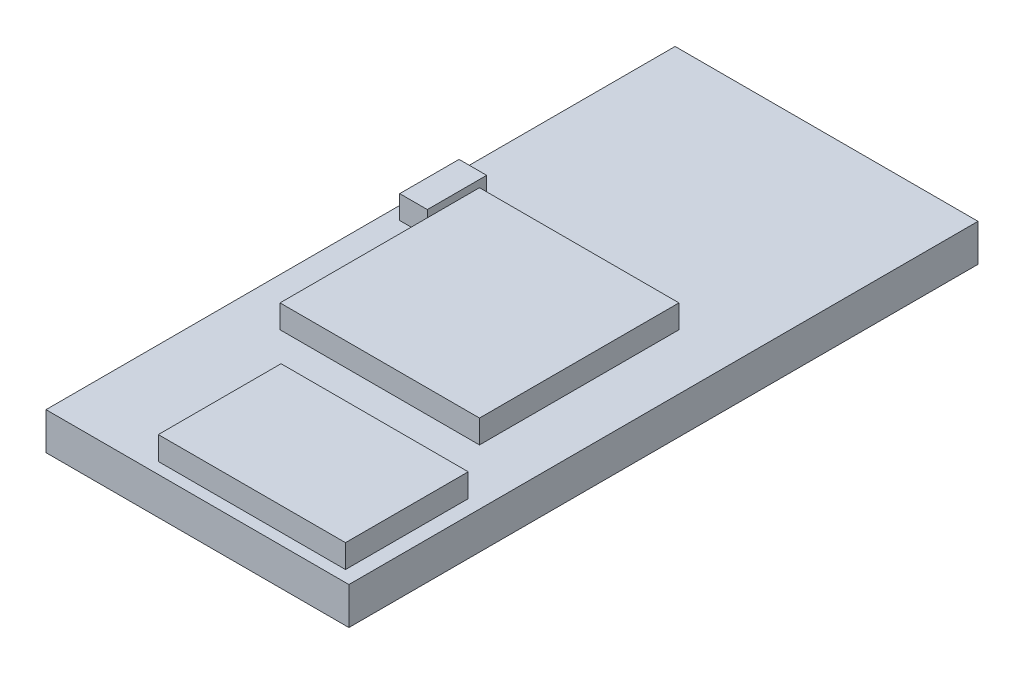
ISO-10303-21;
HEADER;
FILE_DESCRIPTION(('STEP AP214'),'2;1');
FILE_NAME('part.step','',(''),(''),'','','');
FILE_SCHEMA(('AUTOMOTIVE_DESIGN { 1 0 10303 214 1 1 1 1 }'));
ENDSEC;
DATA;
#1=APPLICATION_CONTEXT('core data for automotive mechanical design processes');
#2=APPLICATION_PROTOCOL_DEFINITION('international standard','automotive_design',2000,#1);
#3=PRODUCT_CONTEXT('',#1,'mechanical');
#4=PRODUCT('Part','Part','',(#3));
#5=PRODUCT_RELATED_PRODUCT_CATEGORY('part','',(#4));
#6=PRODUCT_DEFINITION_FORMATION('','',#4);
#7=PRODUCT_DEFINITION_CONTEXT('part definition',#1,'design');
#8=PRODUCT_DEFINITION('design','',#6,#7);
#9=PRODUCT_DEFINITION_SHAPE('','',#8);
#10=(LENGTH_UNIT() NAMED_UNIT(*) SI_UNIT(.MILLI.,.METRE.));
#11=(NAMED_UNIT(*) PLANE_ANGLE_UNIT() SI_UNIT($,.RADIAN.));
#12=(NAMED_UNIT(*) SI_UNIT($,.STERADIAN.) SOLID_ANGLE_UNIT());
#13=UNCERTAINTY_MEASURE_WITH_UNIT(LENGTH_MEASURE(1.E-05),#10,'distance_accuracy_value','');
#14=(GEOMETRIC_REPRESENTATION_CONTEXT(3) GLOBAL_UNCERTAINTY_ASSIGNED_CONTEXT((#13)) GLOBAL_UNIT_ASSIGNED_CONTEXT((#10,
#11,#12)) REPRESENTATION_CONTEXT('',''));
#15=CARTESIAN_POINT('',(0.,0.,0.));
#16=DIRECTION('',(0.,0.,1.));
#17=DIRECTION('',(1.,0.,0.));
#18=AXIS2_PLACEMENT_3D('',#15,#16,#17);
#19=CARTESIAN_POINT('',(0.,1.6,0.));
#20=DIRECTION('',(0.,1.,0.));
#21=DIRECTION('',(0.,0.,1.));
#22=AXIS2_PLACEMENT_3D('',#19,#20,#21);
#23=PLANE('',#22);
#24=DIRECTION('',(-1.,0.,0.));
#25=VECTOR('',#24,1.);
#26=CARTESIAN_POINT('',(4.11453666041133,1.6,-3.05113294731034));
#27=LINE('',#26,#25);
#28=CARTESIAN_POINT('',(4.11453666041133,1.6,-3.05113294731034));
#29=VERTEX_POINT('',#28);
#30=CARTESIAN_POINT('',(-4.44619606945219,1.6,-3.05113294731034));
#31=VERTEX_POINT('',#30);
#32=EDGE_CURVE('E176',#29,#31,#27,.T.);
#33=ORIENTED_EDGE('',*,*,#32,.F.);
#34=DIRECTION('',(0.,0.,-1.));
#35=VECTOR('',#34,1.);
#36=CARTESIAN_POINT('',(4.11453666041133,1.6,5.50959978255318));
#37=LINE('',#36,#35);
#38=CARTESIAN_POINT('',(4.11453666041133,1.6,5.50959978255318));
#39=VERTEX_POINT('',#38);
#40=EDGE_CURVE('E173',#39,#29,#37,.T.);
#41=ORIENTED_EDGE('',*,*,#40,.F.);
#42=DIRECTION('',(1.,0.,0.));
#43=VECTOR('',#42,1.);
#44=CARTESIAN_POINT('',(4.11453666041133,1.6,5.50959978255318));
#45=LINE('',#44,#43);
#46=CARTESIAN_POINT('',(-4.44619606945219,1.6,5.50959978255318));
#47=VERTEX_POINT('',#46);
#48=EDGE_CURVE('E185',#47,#39,#45,.T.);
#49=ORIENTED_EDGE('',*,*,#48,.F.);
#50=DIRECTION('',(0.,0.,1.));
#51=VECTOR('',#50,1.);
#52=CARTESIAN_POINT('',(-4.44619606945219,1.6,5.50959978255318));
#53=LINE('',#52,#51);
#54=EDGE_CURVE('E193',#31,#47,#53,.T.);
#55=ORIENTED_EDGE('',*,*,#54,.F.);
#56=EDGE_LOOP('',(#33,#41,#49,#55));
#57=FACE_BOUND('',#56,.T.);
#58=DIRECTION('',(0.,0.,1.));
#59=VECTOR('',#58,1.);
#60=CARTESIAN_POINT('',(-6.5,1.6,-13.5));
#61=LINE('',#60,#59);
#62=CARTESIAN_POINT('',(-6.5,1.6,-13.5));
#63=VERTEX_POINT('',#62);
#64=CARTESIAN_POINT('',(-6.5,1.6,13.5));
#65=VERTEX_POINT('',#64);
#66=EDGE_CURVE('E234',#63,#65,#61,.T.);
#67=ORIENTED_EDGE('',*,*,#66,.T.);
#68=DIRECTION('',(1.,0.,0.));
#69=VECTOR('',#68,1.);
#70=CARTESIAN_POINT('',(-6.5,1.6,13.5));
#71=LINE('',#70,#69);
#72=CARTESIAN_POINT('',(6.5,1.6,13.5));
#73=VERTEX_POINT('',#72);
#74=EDGE_CURVE('E237',#65,#73,#71,.T.);
#75=ORIENTED_EDGE('',*,*,#74,.T.);
#76=DIRECTION('',(0.,0.,-1.));
#77=VECTOR('',#76,1.);
#78=CARTESIAN_POINT('',(6.5,1.6,-13.5));
#79=LINE('',#78,#77);
#80=CARTESIAN_POINT('',(6.5,1.6,-13.5));
#81=VERTEX_POINT('',#80);
#82=EDGE_CURVE('E240',#73,#81,#79,.T.);
#83=ORIENTED_EDGE('',*,*,#82,.T.);
#84=DIRECTION('',(-1.,0.,0.));
#85=VECTOR('',#84,1.);
#86=CARTESIAN_POINT('',(-6.5,1.6,-13.5));
#87=LINE('',#86,#85);
#88=EDGE_CURVE('E242',#81,#63,#87,.T.);
#89=ORIENTED_EDGE('',*,*,#88,.T.);
#90=EDGE_LOOP('',(#67,#75,#83,#89));
#91=FACE_BOUND('',#90,.T.);
#92=DIRECTION('',(-1.,0.,0.));
#93=VECTOR('',#92,1.);
#94=CARTESIAN_POINT('',(5.87058439987052,1.6,7.74856065036364));
#95=LINE('',#94,#93);
#96=CARTESIAN_POINT('',(5.87058439987052,1.6,7.74856065036364));
#97=VERTEX_POINT('',#96);
#98=CARTESIAN_POINT('',(-2.16333400815525,1.6,7.74856065036364));
#99=VERTEX_POINT('',#98);
#100=EDGE_CURVE('E218',#97,#99,#95,.T.);
#101=ORIENTED_EDGE('',*,*,#100,.F.);
#102=DIRECTION('',(0.,0.,-1.));
#103=VECTOR('',#102,1.);
#104=CARTESIAN_POINT('',(5.87058439987052,1.6,13.0167038687412));
#105=LINE('',#104,#103);
#106=CARTESIAN_POINT('',(5.87058439987052,1.6,13.0167038687412));
#107=VERTEX_POINT('',#106);
#108=EDGE_CURVE('E204',#107,#97,#105,.T.);
#109=ORIENTED_EDGE('',*,*,#108,.F.);
#110=DIRECTION('',(1.,0.,0.));
#111=VECTOR('',#110,1.);
#112=CARTESIAN_POINT('',(5.87058439987052,1.6,13.0167038687412));
#113=LINE('',#112,#111);
#114=CARTESIAN_POINT('',(-2.16333400815525,1.6,13.0167038687412));
#115=VERTEX_POINT('',#114);
#116=EDGE_CURVE('E209',#115,#107,#113,.T.);
#117=ORIENTED_EDGE('',*,*,#116,.F.);
#118=DIRECTION('',(0.,0.,1.));
#119=VECTOR('',#118,1.);
#120=CARTESIAN_POINT('',(-2.16333400815525,1.6,13.0167038687412));
#121=LINE('',#120,#119);
#122=EDGE_CURVE('E220',#99,#115,#121,.T.);
#123=ORIENTED_EDGE('',*,*,#122,.F.);
#124=EDGE_LOOP('',(#101,#109,#117,#123));
#125=FACE_BOUND('',#124,.T.);
#126=DIRECTION('',(1.,0.,0.));
#127=VECTOR('',#126,1.);
#128=CARTESIAN_POINT('',(-5.9388366479925,1.6,-1.11948043390523));
#129=LINE('',#128,#127);
#130=CARTESIAN_POINT('',(-5.9388366479925,1.6,-1.11948043390523));
#131=VERTEX_POINT('',#130);
#132=CARTESIAN_POINT('',(-4.75350442385755,1.6,-1.11948043390523));
#133=VERTEX_POINT('',#132);
#134=EDGE_CURVE('E475',#131,#133,#129,.T.);
#135=ORIENTED_EDGE('',*,*,#134,.F.);
#136=DIRECTION('',(0.,0.,1.));
#137=VECTOR('',#136,1.);
#138=CARTESIAN_POINT('',(-5.9388366479925,1.6,-3.66574965612105));
#139=LINE('',#138,#137);
#140=CARTESIAN_POINT('',(-5.9388366479925,1.6,-3.66574965612105));
#141=VERTEX_POINT('',#140);
#142=EDGE_CURVE('E171',#141,#131,#139,.T.);
#143=ORIENTED_EDGE('',*,*,#142,.F.);
#144=DIRECTION('',(-1.,0.,0.));
#145=VECTOR('',#144,1.);
#146=CARTESIAN_POINT('',(-5.9388366479925,1.6,-3.66574965612105));
#147=LINE('',#146,#145);
#148=CARTESIAN_POINT('',(-4.75350442385755,1.6,-3.66574965612105));
#149=VERTEX_POINT('',#148);
#150=EDGE_CURVE('E167',#149,#141,#147,.T.);
#151=ORIENTED_EDGE('',*,*,#150,.F.);
#152=DIRECTION('',(0.,0.,-1.));
#153=VECTOR('',#152,1.);
#154=CARTESIAN_POINT('',(-4.75350442385755,1.6,-3.66574965612105));
#155=LINE('',#154,#153);
#156=EDGE_CURVE('E472',#133,#149,#155,.T.);
#157=ORIENTED_EDGE('',*,*,#156,.F.);
#158=EDGE_LOOP('',(#135,#143,#151,#157));
#159=FACE_BOUND('',#158,.T.);
#160=ADVANCED_FACE('F34',(#57,#91,#125,#159),#23,.T.);
#161=CARTESIAN_POINT('',(-6.5,1.6,-13.5));
#162=DIRECTION('',(1.,0.,0.));
#163=DIRECTION('',(0.,0.,-1.));
#164=AXIS2_PLACEMENT_3D('',#161,#162,#163);
#165=PLANE('',#164);
#166=DIRECTION('',(0.,0.,1.));
#167=VECTOR('',#166,1.);
#168=CARTESIAN_POINT('',(-6.5,0.,-13.5));
#169=LINE('',#168,#167);
#170=CARTESIAN_POINT('',(-6.5,0.,-13.5));
#171=VERTEX_POINT('',#170);
#172=CARTESIAN_POINT('',(-6.5,0.,13.5));
#173=VERTEX_POINT('',#172);
#174=EDGE_CURVE('E233',#171,#173,#169,.T.);
#175=ORIENTED_EDGE('',*,*,#174,.T.);
#176=DIRECTION('',(0.,-1.,0.));
#177=VECTOR('',#176,1.);
#178=CARTESIAN_POINT('',(-6.5,1.6,13.5));
#179=LINE('',#178,#177);
#180=EDGE_CURVE('E11',#65,#173,#179,.T.);
#181=ORIENTED_EDGE('',*,*,#180,.F.);
#182=ORIENTED_EDGE('',*,*,#66,.F.);
#183=DIRECTION('',(0.,-1.,0.));
#184=VECTOR('',#183,1.);
#185=CARTESIAN_POINT('',(-6.5,1.6,-13.5));
#186=LINE('',#185,#184);
#187=EDGE_CURVE('E244',#63,#171,#186,.T.);
#188=ORIENTED_EDGE('',*,*,#187,.T.);
#189=EDGE_LOOP('',(#175,#181,#182,#188));
#190=FACE_BOUND('',#189,.T.);
#191=ADVANCED_FACE('F36',(#190),#165,.F.);
#192=CARTESIAN_POINT('',(-6.5,1.6,13.5));
#193=DIRECTION('',(0.,0.,-1.));
#194=DIRECTION('',(-1.,0.,0.));
#195=AXIS2_PLACEMENT_3D('',#192,#193,#194);
#196=PLANE('',#195);
#197=DIRECTION('',(1.,0.,0.));
#198=VECTOR('',#197,1.);
#199=CARTESIAN_POINT('',(-6.5,0.,13.5));
#200=LINE('',#199,#198);
#201=CARTESIAN_POINT('',(6.5,0.,13.5));
#202=VERTEX_POINT('',#201);
#203=EDGE_CURVE('E247',#173,#202,#200,.T.);
#204=ORIENTED_EDGE('',*,*,#203,.T.);
#205=DIRECTION('',(0.,-1.,0.));
#206=VECTOR('',#205,1.);
#207=CARTESIAN_POINT('',(6.5,1.6,13.5));
#208=LINE('',#207,#206);
#209=EDGE_CURVE('E42',#73,#202,#208,.T.);
#210=ORIENTED_EDGE('',*,*,#209,.F.);
#211=ORIENTED_EDGE('',*,*,#74,.F.);
#212=ORIENTED_EDGE('',*,*,#180,.T.);
#213=EDGE_LOOP('',(#204,#210,#211,#212));
#214=FACE_BOUND('',#213,.T.);
#215=ADVANCED_FACE('F277',(#214),#196,.F.);
#216=CARTESIAN_POINT('',(6.5,1.6,-13.5));
#217=DIRECTION('',(-1.,0.,0.));
#218=DIRECTION('',(0.,0.,1.));
#219=AXIS2_PLACEMENT_3D('',#216,#217,#218);
#220=PLANE('',#219);
#221=DIRECTION('',(0.,0.,-1.));
#222=VECTOR('',#221,1.);
#223=CARTESIAN_POINT('',(6.5,0.,-13.5));
#224=LINE('',#223,#222);
#225=CARTESIAN_POINT('',(6.5,0.,-13.5));
#226=VERTEX_POINT('',#225);
#227=EDGE_CURVE('E249',#202,#226,#224,.T.);
#228=ORIENTED_EDGE('',*,*,#227,.T.);
#229=DIRECTION('',(0.,-1.,0.));
#230=VECTOR('',#229,1.);
#231=CARTESIAN_POINT('',(6.5,1.6,-13.5));
#232=LINE('',#231,#230);
#233=EDGE_CURVE('E254',#81,#226,#232,.T.);
#234=ORIENTED_EDGE('',*,*,#233,.F.);
#235=ORIENTED_EDGE('',*,*,#82,.F.);
#236=ORIENTED_EDGE('',*,*,#209,.T.);
#237=EDGE_LOOP('',(#228,#234,#235,#236));
#238=FACE_BOUND('',#237,.T.);
#239=ADVANCED_FACE('F261',(#238),#220,.F.);
#240=CARTESIAN_POINT('',(-6.5,1.6,-13.5));
#241=DIRECTION('',(0.,0.,1.));
#242=DIRECTION('',(1.,0.,0.));
#243=AXIS2_PLACEMENT_3D('',#240,#241,#242);
#244=PLANE('',#243);
#245=DIRECTION('',(-1.,0.,0.));
#246=VECTOR('',#245,1.);
#247=CARTESIAN_POINT('',(-6.5,0.,-13.5));
#248=LINE('',#247,#246);
#249=EDGE_CURVE('E238',#226,#171,#248,.T.);
#250=ORIENTED_EDGE('',*,*,#249,.T.);
#251=ORIENTED_EDGE('',*,*,#187,.F.);
#252=ORIENTED_EDGE('',*,*,#88,.F.);
#253=ORIENTED_EDGE('',*,*,#233,.T.);
#254=EDGE_LOOP('',(#250,#251,#252,#253));
#255=FACE_BOUND('',#254,.T.);
#256=ADVANCED_FACE('F270',(#255),#244,.F.);
#257=CARTESIAN_POINT('',(0.,0.,0.));
#258=DIRECTION('',(0.,1.,0.));
#259=DIRECTION('',(0.,0.,1.));
#260=AXIS2_PLACEMENT_3D('',#257,#258,#259);
#261=PLANE('',#260);
#262=ORIENTED_EDGE('',*,*,#174,.F.);
#263=ORIENTED_EDGE('',*,*,#249,.F.);
#264=ORIENTED_EDGE('',*,*,#227,.F.);
#265=ORIENTED_EDGE('',*,*,#203,.F.);
#266=EDGE_LOOP('',(#262,#263,#264,#265));
#267=FACE_BOUND('',#266,.T.);
#268=ADVANCED_FACE('F267',(#267),#261,.F.);
#269=CARTESIAN_POINT('',(5.87058439987052,2.6,13.0167038687412));
#270=DIRECTION('',(-1.,0.,0.));
#271=DIRECTION('',(0.,0.,1.));
#272=AXIS2_PLACEMENT_3D('',#269,#270,#271);
#273=PLANE('',#272);
#274=ORIENTED_EDGE('',*,*,#108,.T.);
#275=DIRECTION('',(0.,-1.,0.));
#276=VECTOR('',#275,1.);
#277=CARTESIAN_POINT('',(5.87058439987052,2.6,7.74856065036364));
#278=LINE('',#277,#276);
#279=CARTESIAN_POINT('',(5.87058439987052,2.6,7.74856065036364));
#280=VERTEX_POINT('',#279);
#281=EDGE_CURVE('E231',#280,#97,#278,.T.);
#282=ORIENTED_EDGE('',*,*,#281,.F.);
#283=DIRECTION('',(0.,0.,-1.));
#284=VECTOR('',#283,1.);
#285=CARTESIAN_POINT('',(5.87058439987052,2.6,13.0167038687412));
#286=LINE('',#285,#284);
#287=CARTESIAN_POINT('',(5.87058439987052,2.6,13.0167038687412));
#288=VERTEX_POINT('',#287);
#289=EDGE_CURVE('E205',#288,#280,#286,.T.);
#290=ORIENTED_EDGE('',*,*,#289,.F.);
#291=DIRECTION('',(0.,-1.,0.));
#292=VECTOR('',#291,1.);
#293=CARTESIAN_POINT('',(5.87058439987052,2.6,13.0167038687412));
#294=LINE('',#293,#292);
#295=EDGE_CURVE('E215',#288,#107,#294,.T.);
#296=ORIENTED_EDGE('',*,*,#295,.T.);
#297=EDGE_LOOP('',(#274,#282,#290,#296));
#298=FACE_BOUND('',#297,.T.);
#299=ADVANCED_FACE('F292',(#298),#273,.F.);
#300=CARTESIAN_POINT('',(5.87058439987052,2.6,7.74856065036364));
#301=DIRECTION('',(0.,0.,1.));
#302=DIRECTION('',(1.,0.,0.));
#303=AXIS2_PLACEMENT_3D('',#300,#301,#302);
#304=PLANE('',#303);
#305=ORIENTED_EDGE('',*,*,#100,.T.);
#306=DIRECTION('',(0.,-1.,0.));
#307=VECTOR('',#306,1.);
#308=CARTESIAN_POINT('',(-2.16333400815525,2.6,7.74856065036364));
#309=LINE('',#308,#307);
#310=CARTESIAN_POINT('',(-2.16333400815525,2.6,7.74856065036364));
#311=VERTEX_POINT('',#310);
#312=EDGE_CURVE('E228',#311,#99,#309,.T.);
#313=ORIENTED_EDGE('',*,*,#312,.F.);
#314=DIRECTION('',(-1.,0.,0.));
#315=VECTOR('',#314,1.);
#316=CARTESIAN_POINT('',(5.87058439987052,2.6,7.74856065036364));
#317=LINE('',#316,#315);
#318=EDGE_CURVE('E208',#280,#311,#317,.T.);
#319=ORIENTED_EDGE('',*,*,#318,.F.);
#320=ORIENTED_EDGE('',*,*,#281,.T.);
#321=EDGE_LOOP('',(#305,#313,#319,#320));
#322=FACE_BOUND('',#321,.T.);
#323=ADVANCED_FACE('F311',(#322),#304,.F.);
#324=CARTESIAN_POINT('',(-2.16333400815525,2.6,13.0167038687412));
#325=DIRECTION('',(1.,0.,0.));
#326=DIRECTION('',(0.,0.,-1.));
#327=AXIS2_PLACEMENT_3D('',#324,#325,#326);
#328=PLANE('',#327);
#329=ORIENTED_EDGE('',*,*,#122,.T.);
#330=DIRECTION('',(0.,-1.,0.));
#331=VECTOR('',#330,1.);
#332=CARTESIAN_POINT('',(-2.16333400815525,2.6,13.0167038687412));
#333=LINE('',#332,#331);
#334=CARTESIAN_POINT('',(-2.16333400815525,2.6,13.0167038687412));
#335=VERTEX_POINT('',#334);
#336=EDGE_CURVE('E226',#335,#115,#333,.T.);
#337=ORIENTED_EDGE('',*,*,#336,.F.);
#338=DIRECTION('',(0.,0.,1.));
#339=VECTOR('',#338,1.);
#340=CARTESIAN_POINT('',(-2.16333400815525,2.6,13.0167038687412));
#341=LINE('',#340,#339);
#342=EDGE_CURVE('E211',#311,#335,#341,.T.);
#343=ORIENTED_EDGE('',*,*,#342,.F.);
#344=ORIENTED_EDGE('',*,*,#312,.T.);
#345=EDGE_LOOP('',(#329,#337,#343,#344));
#346=FACE_BOUND('',#345,.T.);
#347=ADVANCED_FACE('F318',(#346),#328,.F.);
#348=CARTESIAN_POINT('',(5.87058439987052,2.6,13.0167038687412));
#349=DIRECTION('',(0.,0.,-1.));
#350=DIRECTION('',(-1.,0.,0.));
#351=AXIS2_PLACEMENT_3D('',#348,#349,#350);
#352=PLANE('',#351);
#353=ORIENTED_EDGE('',*,*,#116,.T.);
#354=ORIENTED_EDGE('',*,*,#295,.F.);
#355=DIRECTION('',(1.,0.,0.));
#356=VECTOR('',#355,1.);
#357=CARTESIAN_POINT('',(5.87058439987052,2.6,13.0167038687412));
#358=LINE('',#357,#356);
#359=EDGE_CURVE('E213',#335,#288,#358,.T.);
#360=ORIENTED_EDGE('',*,*,#359,.F.);
#361=ORIENTED_EDGE('',*,*,#336,.T.);
#362=EDGE_LOOP('',(#353,#354,#360,#361));
#363=FACE_BOUND('',#362,.T.);
#364=ADVANCED_FACE('F325',(#363),#352,.F.);
#365=CARTESIAN_POINT('',(0.,2.6,0.));
#366=DIRECTION('',(0.,1.,0.));
#367=DIRECTION('',(0.,0.,1.));
#368=AXIS2_PLACEMENT_3D('',#365,#366,#367);
#369=PLANE('',#368);
#370=ORIENTED_EDGE('',*,*,#289,.T.);
#371=ORIENTED_EDGE('',*,*,#318,.T.);
#372=ORIENTED_EDGE('',*,*,#342,.T.);
#373=ORIENTED_EDGE('',*,*,#359,.T.);
#374=EDGE_LOOP('',(#370,#371,#372,#373));
#375=FACE_BOUND('',#374,.T.);
#376=ADVANCED_FACE('F333',(#375),#369,.T.);
#377=CARTESIAN_POINT('',(4.11453666041133,2.6,5.50959978255318));
#378=DIRECTION('',(-1.,0.,0.));
#379=DIRECTION('',(0.,0.,1.));
#380=AXIS2_PLACEMENT_3D('',#377,#378,#379);
#381=PLANE('',#380);
#382=ORIENTED_EDGE('',*,*,#40,.T.);
#383=DIRECTION('',(0.,-1.,0.));
#384=VECTOR('',#383,1.);
#385=CARTESIAN_POINT('',(4.11453666041133,2.6,-3.05113294731034));
#386=LINE('',#385,#384);
#387=CARTESIAN_POINT('',(4.11453666041133,2.6,-3.05113294731034));
#388=VERTEX_POINT('',#387);
#389=EDGE_CURVE('E202',#388,#29,#386,.T.);
#390=ORIENTED_EDGE('',*,*,#389,.F.);
#391=DIRECTION('',(0.,0.,-1.));
#392=VECTOR('',#391,1.);
#393=CARTESIAN_POINT('',(4.11453666041133,2.6,5.50959978255318));
#394=LINE('',#393,#392);
#395=CARTESIAN_POINT('',(4.11453666041133,2.6,5.50959978255318));
#396=VERTEX_POINT('',#395);
#397=EDGE_CURVE('E181',#396,#388,#394,.T.);
#398=ORIENTED_EDGE('',*,*,#397,.F.);
#399=DIRECTION('',(0.,-1.,0.));
#400=VECTOR('',#399,1.);
#401=CARTESIAN_POINT('',(4.11453666041133,2.6,5.50959978255318));
#402=LINE('',#401,#400);
#403=EDGE_CURVE('E190',#396,#39,#402,.T.);
#404=ORIENTED_EDGE('',*,*,#403,.T.);
#405=EDGE_LOOP('',(#382,#390,#398,#404));
#406=FACE_BOUND('',#405,.T.);
#407=ADVANCED_FACE('F341',(#406),#381,.F.);
#408=CARTESIAN_POINT('',(4.11453666041133,2.6,-3.05113294731034));
#409=DIRECTION('',(0.,0.,1.));
#410=DIRECTION('',(1.,0.,0.));
#411=AXIS2_PLACEMENT_3D('',#408,#409,#410);
#412=PLANE('',#411);
#413=ORIENTED_EDGE('',*,*,#32,.T.);
#414=DIRECTION('',(0.,-1.,0.));
#415=VECTOR('',#414,1.);
#416=CARTESIAN_POINT('',(-4.44619606945219,2.6,-3.05113294731034));
#417=LINE('',#416,#415);
#418=CARTESIAN_POINT('',(-4.44619606945219,2.6,-3.05113294731034));
#419=VERTEX_POINT('',#418);
#420=EDGE_CURVE('E199',#419,#31,#417,.T.);
#421=ORIENTED_EDGE('',*,*,#420,.F.);
#422=DIRECTION('',(-1.,0.,0.));
#423=VECTOR('',#422,1.);
#424=CARTESIAN_POINT('',(4.11453666041133,2.6,-3.05113294731034));
#425=LINE('',#424,#423);
#426=EDGE_CURVE('E184',#388,#419,#425,.T.);
#427=ORIENTED_EDGE('',*,*,#426,.F.);
#428=ORIENTED_EDGE('',*,*,#389,.T.);
#429=EDGE_LOOP('',(#413,#421,#427,#428));
#430=FACE_BOUND('',#429,.T.);
#431=ADVANCED_FACE('F349',(#430),#412,.F.);
#432=CARTESIAN_POINT('',(-4.44619606945219,2.6,5.50959978255318));
#433=DIRECTION('',(1.,0.,0.));
#434=DIRECTION('',(0.,0.,-1.));
#435=AXIS2_PLACEMENT_3D('',#432,#433,#434);
#436=PLANE('',#435);
#437=ORIENTED_EDGE('',*,*,#54,.T.);
#438=DIRECTION('',(0.,-1.,0.));
#439=VECTOR('',#438,1.);
#440=CARTESIAN_POINT('',(-4.44619606945219,2.6,5.50959978255318));
#441=LINE('',#440,#439);
#442=CARTESIAN_POINT('',(-4.44619606945219,2.6,5.50959978255318));
#443=VERTEX_POINT('',#442);
#444=EDGE_CURVE('E57',#443,#47,#441,.T.);
#445=ORIENTED_EDGE('',*,*,#444,.F.);
#446=DIRECTION('',(0.,0.,1.));
#447=VECTOR('',#446,1.);
#448=CARTESIAN_POINT('',(-4.44619606945219,2.6,5.50959978255318));
#449=LINE('',#448,#447);
#450=EDGE_CURVE('E187',#419,#443,#449,.T.);
#451=ORIENTED_EDGE('',*,*,#450,.F.);
#452=ORIENTED_EDGE('',*,*,#420,.T.);
#453=EDGE_LOOP('',(#437,#445,#451,#452));
#454=FACE_BOUND('',#453,.T.);
#455=ADVANCED_FACE('F357',(#454),#436,.F.);
#456=CARTESIAN_POINT('',(4.11453666041133,2.6,5.50959978255318));
#457=DIRECTION('',(0.,0.,-1.));
#458=DIRECTION('',(-1.,0.,0.));
#459=AXIS2_PLACEMENT_3D('',#456,#457,#458);
#460=PLANE('',#459);
#461=ORIENTED_EDGE('',*,*,#48,.T.);
#462=ORIENTED_EDGE('',*,*,#403,.F.);
#463=DIRECTION('',(1.,0.,0.));
#464=VECTOR('',#463,1.);
#465=CARTESIAN_POINT('',(4.11453666041133,2.6,5.50959978255318));
#466=LINE('',#465,#464);
#467=EDGE_CURVE('E189',#443,#396,#466,.T.);
#468=ORIENTED_EDGE('',*,*,#467,.F.);
#469=ORIENTED_EDGE('',*,*,#444,.T.);
#470=EDGE_LOOP('',(#461,#462,#468,#469));
#471=FACE_BOUND('',#470,.T.);
#472=ADVANCED_FACE('F365',(#471),#460,.F.);
#473=CARTESIAN_POINT('',(0.,2.6,0.));
#474=DIRECTION('',(0.,1.,0.));
#475=DIRECTION('',(0.,0.,1.));
#476=AXIS2_PLACEMENT_3D('',#473,#474,#475);
#477=PLANE('',#476);
#478=ORIENTED_EDGE('',*,*,#397,.T.);
#479=ORIENTED_EDGE('',*,*,#426,.T.);
#480=ORIENTED_EDGE('',*,*,#450,.T.);
#481=ORIENTED_EDGE('',*,*,#467,.T.);
#482=EDGE_LOOP('',(#478,#479,#480,#481));
#483=FACE_BOUND('',#482,.T.);
#484=ADVANCED_FACE('F373',(#483),#477,.T.);
#485=CARTESIAN_POINT('',(-5.9388366479925,2.6,-3.66574965612105));
#486=DIRECTION('',(1.,0.,0.));
#487=DIRECTION('',(0.,0.,-1.));
#488=AXIS2_PLACEMENT_3D('',#485,#486,#487);
#489=PLANE('',#488);
#490=ORIENTED_EDGE('',*,*,#142,.T.);
#491=DIRECTION('',(0.,-1.,0.));
#492=VECTOR('',#491,1.);
#493=CARTESIAN_POINT('',(-5.9388366479925,2.6,-1.11948043390523));
#494=LINE('',#493,#492);
#495=CARTESIAN_POINT('',(-5.9388366479925,2.6,-1.11948043390523));
#496=VERTEX_POINT('',#495);
#497=EDGE_CURVE('E152',#496,#131,#494,.T.);
#498=ORIENTED_EDGE('',*,*,#497,.F.);
#499=DIRECTION('',(0.,0.,1.));
#500=VECTOR('',#499,1.);
#501=CARTESIAN_POINT('',(-5.9388366479925,2.6,-3.66574965612105));
#502=LINE('',#501,#500);
#503=CARTESIAN_POINT('',(-5.9388366479925,2.6,-3.66574965612105));
#504=VERTEX_POINT('',#503);
#505=EDGE_CURVE('E159',#504,#496,#502,.T.);
#506=ORIENTED_EDGE('',*,*,#505,.F.);
#507=DIRECTION('',(0.,-1.,0.));
#508=VECTOR('',#507,1.);
#509=CARTESIAN_POINT('',(-5.9388366479925,2.6,-3.66574965612105));
#510=LINE('',#509,#508);
#511=EDGE_CURVE('E469',#504,#141,#510,.T.);
#512=ORIENTED_EDGE('',*,*,#511,.T.);
#513=EDGE_LOOP('',(#490,#498,#506,#512));
#514=FACE_BOUND('',#513,.T.);
#515=ADVANCED_FACE('F169',(#514),#489,.F.);
#516=CARTESIAN_POINT('',(-5.9388366479925,2.6,-1.11948043390523));
#517=DIRECTION('',(0.,0.,-1.));
#518=DIRECTION('',(-1.,0.,0.));
#519=AXIS2_PLACEMENT_3D('',#516,#517,#518);
#520=PLANE('',#519);
#521=ORIENTED_EDGE('',*,*,#134,.T.);
#522=DIRECTION('',(0.,-1.,0.));
#523=VECTOR('',#522,1.);
#524=CARTESIAN_POINT('',(-4.75350442385755,2.6,-1.11948043390523));
#525=LINE('',#524,#523);
#526=CARTESIAN_POINT('',(-4.75350442385755,2.6,-1.11948043390523));
#527=VERTEX_POINT('',#526);
#528=EDGE_CURVE('E155',#527,#133,#525,.T.);
#529=ORIENTED_EDGE('',*,*,#528,.F.);
#530=DIRECTION('',(1.,0.,0.));
#531=VECTOR('',#530,1.);
#532=CARTESIAN_POINT('',(-5.9388366479925,2.6,-1.11948043390523));
#533=LINE('',#532,#531);
#534=EDGE_CURVE('E148',#496,#527,#533,.T.);
#535=ORIENTED_EDGE('',*,*,#534,.F.);
#536=ORIENTED_EDGE('',*,*,#497,.T.);
#537=EDGE_LOOP('',(#521,#529,#535,#536));
#538=FACE_BOUND('',#537,.T.);
#539=ADVANCED_FACE('F150',(#538),#520,.F.);
#540=CARTESIAN_POINT('',(-4.75350442385755,2.6,-3.66574965612105));
#541=DIRECTION('',(-1.,0.,0.));
#542=DIRECTION('',(0.,0.,1.));
#543=AXIS2_PLACEMENT_3D('',#540,#541,#542);
#544=PLANE('',#543);
#545=ORIENTED_EDGE('',*,*,#156,.T.);
#546=DIRECTION('',(0.,-1.,0.));
#547=VECTOR('',#546,1.);
#548=CARTESIAN_POINT('',(-4.75350442385755,2.6,-3.66574965612105));
#549=LINE('',#548,#547);
#550=CARTESIAN_POINT('',(-4.75350442385755,2.6,-3.66574965612105));
#551=VERTEX_POINT('',#550);
#552=EDGE_CURVE('E49',#551,#149,#549,.T.);
#553=ORIENTED_EDGE('',*,*,#552,.F.);
#554=DIRECTION('',(0.,0.,-1.));
#555=VECTOR('',#554,1.);
#556=CARTESIAN_POINT('',(-4.75350442385755,2.6,-3.66574965612105));
#557=LINE('',#556,#555);
#558=EDGE_CURVE('E158',#527,#551,#557,.T.);
#559=ORIENTED_EDGE('',*,*,#558,.F.);
#560=ORIENTED_EDGE('',*,*,#528,.T.);
#561=EDGE_LOOP('',(#545,#553,#559,#560));
#562=FACE_BOUND('',#561,.T.);
#563=ADVANCED_FACE('F393',(#562),#544,.F.);
#564=CARTESIAN_POINT('',(-5.9388366479925,2.6,-3.66574965612105));
#565=DIRECTION('',(0.,0.,1.));
#566=DIRECTION('',(1.,0.,0.));
#567=AXIS2_PLACEMENT_3D('',#564,#565,#566);
#568=PLANE('',#567);
#569=ORIENTED_EDGE('',*,*,#150,.T.);
#570=ORIENTED_EDGE('',*,*,#511,.F.);
#571=DIRECTION('',(-1.,0.,0.));
#572=VECTOR('',#571,1.);
#573=CARTESIAN_POINT('',(-5.9388366479925,2.6,-3.66574965612105));
#574=LINE('',#573,#572);
#575=EDGE_CURVE('E163',#551,#504,#574,.T.);
#576=ORIENTED_EDGE('',*,*,#575,.F.);
#577=ORIENTED_EDGE('',*,*,#552,.T.);
#578=EDGE_LOOP('',(#569,#570,#576,#577));
#579=FACE_BOUND('',#578,.T.);
#580=ADVANCED_FACE('F400',(#579),#568,.F.);
#581=CARTESIAN_POINT('',(0.,2.6,0.));
#582=DIRECTION('',(0.,1.,0.));
#583=DIRECTION('',(0.,0.,1.));
#584=AXIS2_PLACEMENT_3D('',#581,#582,#583);
#585=PLANE('',#584);
#586=ORIENTED_EDGE('',*,*,#505,.T.);
#587=ORIENTED_EDGE('',*,*,#534,.T.);
#588=ORIENTED_EDGE('',*,*,#558,.T.);
#589=ORIENTED_EDGE('',*,*,#575,.T.);
#590=EDGE_LOOP('',(#586,#587,#588,#589));
#591=FACE_BOUND('',#590,.T.);
#592=ADVANCED_FACE('F162',(#591),#585,.T.);
#593=CLOSED_SHELL('',(#160,#191,#215,#239,#256,#268,#299,#323,#347,#364,#376,#407,#431,#455,
#472,#484,#515,#539,#563,#580,#592));
#594=MANIFOLD_SOLID_BREP('B2',#593);
#595=ADVANCED_BREP_SHAPE_REPRESENTATION('',(#18,#594),#14);
#596=SHAPE_DEFINITION_REPRESENTATION(#9,#595);
ENDSEC;
END-ISO-10303-21;
